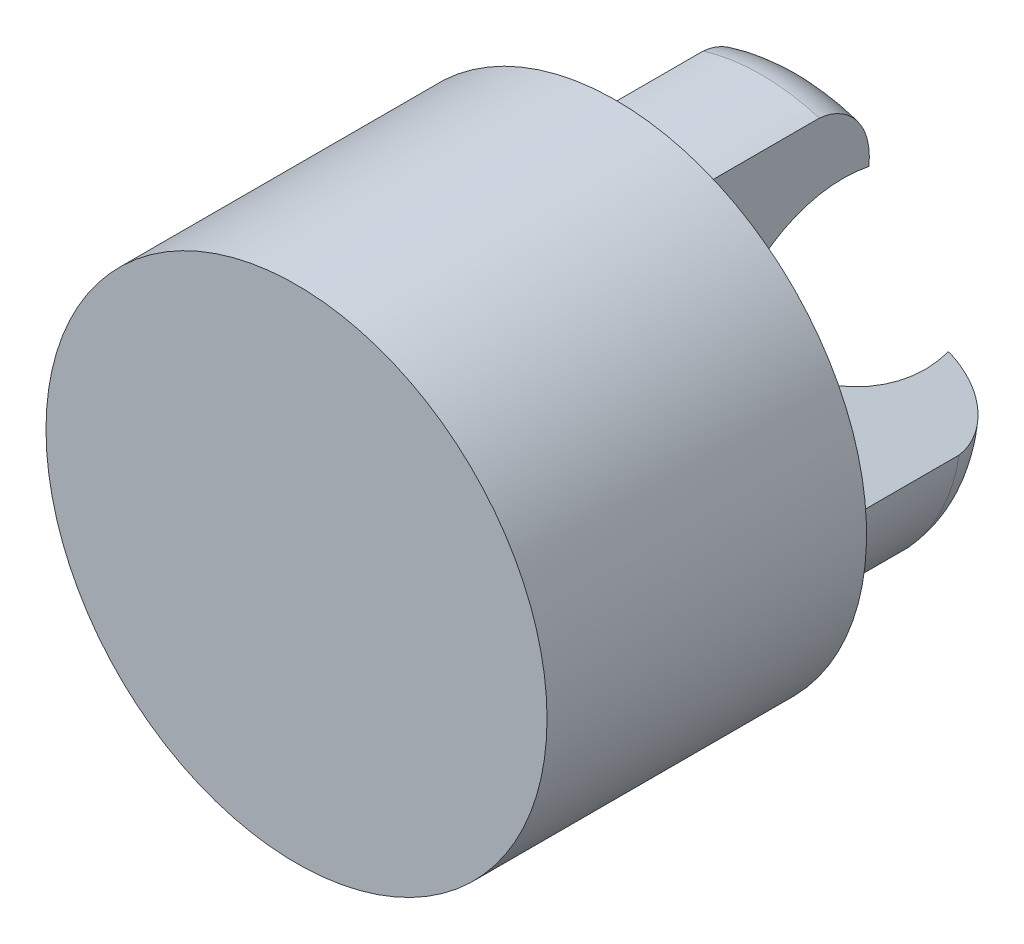
ISO-10303-21;
HEADER;
FILE_DESCRIPTION(('STEP AP214'),'2;1');
FILE_NAME('part.step','',(''),(''),'','','');
FILE_SCHEMA(('AUTOMOTIVE_DESIGN { 1 0 10303 214 1 1 1 1 }'));
ENDSEC;
DATA;
#1=APPLICATION_CONTEXT('core data for automotive mechanical design processes');
#2=APPLICATION_PROTOCOL_DEFINITION('international standard','automotive_design',2000,#1);
#3=PRODUCT_CONTEXT('',#1,'mechanical');
#4=PRODUCT('Part','Part','',(#3));
#5=PRODUCT_RELATED_PRODUCT_CATEGORY('part','',(#4));
#6=PRODUCT_DEFINITION_FORMATION('','',#4);
#7=PRODUCT_DEFINITION_CONTEXT('part definition',#1,'design');
#8=PRODUCT_DEFINITION('design','',#6,#7);
#9=PRODUCT_DEFINITION_SHAPE('','',#8);
#10=(LENGTH_UNIT() NAMED_UNIT(*) SI_UNIT(.MILLI.,.METRE.));
#11=(NAMED_UNIT(*) PLANE_ANGLE_UNIT() SI_UNIT($,.RADIAN.));
#12=(NAMED_UNIT(*) SI_UNIT($,.STERADIAN.) SOLID_ANGLE_UNIT());
#13=UNCERTAINTY_MEASURE_WITH_UNIT(LENGTH_MEASURE(1.E-05),#10,'distance_accuracy_value','');
#14=(GEOMETRIC_REPRESENTATION_CONTEXT(3) GLOBAL_UNCERTAINTY_ASSIGNED_CONTEXT((#13)) GLOBAL_UNIT_ASSIGNED_CONTEXT((#10,
#11,#12)) REPRESENTATION_CONTEXT('',''));
#15=CARTESIAN_POINT('',(0.,0.,0.));
#16=DIRECTION('',(0.,0.,1.));
#17=DIRECTION('',(1.,0.,0.));
#18=AXIS2_PLACEMENT_3D('',#15,#16,#17);
#19=CARTESIAN_POINT('',(18.3,9.34665715643834,0.));
#20=DIRECTION('',(0.,0.,1.));
#21=DIRECTION('',(1.,0.,0.));
#22=AXIS2_PLACEMENT_3D('',#19,#20,#21);
#23=PLANE('',#22);
#24=DIRECTION('',(0.866025403784441,-0.499999999999996,0.));
#25=VECTOR('',#24,1.);
#26=CARTESIAN_POINT('',(2.,1.73410161513776,0.));
#27=LINE('',#26,#25);
#28=CARTESIAN_POINT('',(2.,1.73410161513776,0.));
#29=VERTEX_POINT('',#28);
#30=CARTESIAN_POINT('',(6.81198256243961,-1.04409781262251,0.));
#31=VERTEX_POINT('',#30);
#32=EDGE_CURVE('E182',#29,#31,#27,.T.);
#33=ORIENTED_EDGE('',*,*,#32,.F.);
#34=DIRECTION('',(0.,-1.,0.));
#35=VECTOR('',#34,1.);
#36=CARTESIAN_POINT('',(2.,19.3263173688128,0.));
#37=LINE('',#36,#35);
#38=CARTESIAN_POINT('',(2.,6.59494099088873,0.));
#39=VERTEX_POINT('',#38);
#40=EDGE_CURVE('E151',#39,#29,#37,.T.);
#41=ORIENTED_EDGE('',*,*,#40,.F.);
#42=CARTESIAN_POINT('',(0.,0.,0.));
#43=DIRECTION('',(0.,0.,1.));
#44=DIRECTION('',(1.,0.,0.));
#45=AXIS2_PLACEMENT_3D('',#42,#43,#44);
#46=CIRCLE('',#45,6.89153442081692);
#47=CARTESIAN_POINT('',(-2.,6.59494099088873,0.));
#48=VERTEX_POINT('',#47);
#49=EDGE_CURVE('E158',#39,#48,#46,.T.);
#50=ORIENTED_EDGE('',*,*,#49,.T.);
#51=DIRECTION('',(0.,1.,0.));
#52=VECTOR('',#51,1.);
#53=CARTESIAN_POINT('',(-2.,19.3263173688128,0.));
#54=LINE('',#53,#52);
#55=CARTESIAN_POINT('',(-2.,1.73410161513775,0.));
#56=VERTEX_POINT('',#55);
#57=EDGE_CURVE('E271',#56,#48,#54,.T.);
#58=ORIENTED_EDGE('',*,*,#57,.F.);
#59=DIRECTION('',(0.866025403784441,0.499999999999995,0.));
#60=VECTOR('',#59,1.);
#61=CARTESIAN_POINT('',(-2.,1.73410161513775,0.));
#62=LINE('',#61,#60);
#63=CARTESIAN_POINT('',(-6.81198256243961,-1.0440978126225,0.));
#64=VERTEX_POINT('',#63);
#65=EDGE_CURVE('E278',#64,#56,#62,.T.);
#66=ORIENTED_EDGE('',*,*,#65,.F.);
#67=CARTESIAN_POINT('',(-5.07638618081831,-4.66085292800591,0.));
#68=VERTEX_POINT('',#67);
#69=EDGE_CURVE('E130',#64,#68,#46,.T.);
#70=ORIENTED_EDGE('',*,*,#69,.T.);
#71=DIRECTION('',(-0.866025403784441,-0.499999999999995,0.));
#72=VECTOR('',#71,1.);
#73=CARTESIAN_POINT('',(0.,-1.73,0.));
#74=LINE('',#73,#72);
#75=CARTESIAN_POINT('',(0.,-1.73,0.));
#76=VERTEX_POINT('',#75);
#77=EDGE_CURVE('E125',#76,#68,#74,.T.);
#78=ORIENTED_EDGE('',*,*,#77,.F.);
#79=DIRECTION('',(-0.866025403784441,0.499999999999996,0.));
#80=VECTOR('',#79,1.);
#81=CARTESIAN_POINT('',(-0.749111974273535,-1.29750000000001,0.));
#82=LINE('',#81,#80);
#83=CARTESIAN_POINT('',(5.07638618081831,-4.66085292800591,0.));
#84=VERTEX_POINT('',#83);
#85=EDGE_CURVE('E11',#84,#76,#82,.T.);
#86=ORIENTED_EDGE('',*,*,#85,.F.);
#87=EDGE_CURVE('E154',#84,#31,#46,.T.);
#88=ORIENTED_EDGE('',*,*,#87,.T.);
#89=EDGE_LOOP('',(#33,#41,#50,#58,#66,#70,#78,#86,#88));
#90=FACE_BOUND('',#89,.T.);
#91=CARTESIAN_POINT('',(0.,0.,0.));
#92=DIRECTION('',(0.,0.,-1.));
#93=DIRECTION('',(-1.,0.,0.));
#94=AXIS2_PLACEMENT_3D('',#91,#92,#93);
#95=CIRCLE('',#94,8.625);
#96=CARTESIAN_POINT('',(-8.625,0.,0.));
#97=VERTEX_POINT('',#96);
#98=EDGE_CURVE('E134',#97,#97,#95,.T.);
#99=ORIENTED_EDGE('',*,*,#98,.T.);
#100=EDGE_LOOP('',(#99));
#101=FACE_BOUND('',#100,.T.);
#102=ADVANCED_FACE('F34',(#90,#101),#23,.F.);
#103=CARTESIAN_POINT('',(0.,0.,-4.82084215098187));
#104=DIRECTION('',(0.,0.,1.));
#105=DIRECTION('',(1.,0.,0.));
#106=AXIS2_PLACEMENT_3D('',#103,#104,#105);
#107=TOROIDAL_SURFACE('',#106,5.,1.9);
#108=CARTESIAN_POINT('',(-5.07640297856512,-4.66086262618956,-4.9998));
#109=CARTESIAN_POINT('',(-5.07200709962977,-4.6583246643029,-5.05216996781322));
#110=CARTESIAN_POINT('',(-5.06568283371944,-4.65467334767715,-5.10429822705954));
#111=CARTESIAN_POINT('',(-5.04923229746504,-4.64517562614236,-5.20774325054465));
#112=CARTESIAN_POINT('',(-5.03910640937487,-4.63932944192771,-5.25906009583084));
#113=CARTESIAN_POINT('',(-5.0031606670284,-4.61857615790776,-5.41108831311908));
#114=CARTESIAN_POINT('',(-4.97175238019148,-4.60044257504768,-5.51011648743511));
#115=CARTESIAN_POINT('',(-4.89502264517052,-4.55614264187848,-5.70065974165119));
#116=CARTESIAN_POINT('',(-4.84969821042528,-4.52997456727745,-5.79217320346123));
#117=CARTESIAN_POINT('',(-4.74652187644407,-4.47040568307939,-5.96524209523091));
#118=CARTESIAN_POINT('',(-4.68867027460166,-4.43700504518263,-6.04679776151564));
#119=CARTESIAN_POINT('',(-4.56148445498952,-4.36357427799246,-6.19864064888333));
#120=CARTESIAN_POINT('',(-4.49203351288589,-4.32347675787345,-6.26879734540966));
#121=CARTESIAN_POINT('',(-4.34412909354509,-4.23808410155271,-6.39505781947714));
#122=CARTESIAN_POINT('',(-4.26567367003562,-4.19278784167013,-6.45115855052141));
#123=CARTESIAN_POINT('',(-4.09985754674565,-4.09705385825269,-6.5493044048502));
#124=CARTESIAN_POINT('',(-4.01231910157031,-4.04651351336627,-6.59094880890211));
#125=CARTESIAN_POINT('',(-3.83257017301974,-3.94273542108105,-6.65731974821868));
#126=CARTESIAN_POINT('',(-3.74035920477146,-3.88949739374067,-6.68204452383682));
#127=CARTESIAN_POINT('',(-3.55038672462432,-3.7798167311891,-6.71484749553911));
#128=CARTESIAN_POINT('',(-3.45254448726781,-3.7233274891132,-6.72230156778718));
#129=CARTESIAN_POINT('',(-3.25710211699191,-3.61048878402336,-6.71890951211631));
#130=CARTESIAN_POINT('',(-3.15950203764875,-3.55413935194165,-6.70805964317628));
#131=CARTESIAN_POINT('',(-2.96318334370289,-3.44079470114506,-6.66785278506185));
#132=CARTESIAN_POINT('',(-2.8645752976373,-3.38386331920483,-6.63777511701229));
#133=CARTESIAN_POINT('',(-2.67290709139947,-3.27320362873832,-6.55947161082214));
#134=CARTESIAN_POINT('',(-2.5798482893061,-3.21947610429925,-6.5112413511017));
#135=CARTESIAN_POINT('',(-2.39927715127796,-3.11522330915083,-6.39631677227074));
#136=CARTESIAN_POINT('',(-2.31199264931436,-3.06482957844606,-6.32914389532173));
#137=CARTESIAN_POINT('',(-2.14857426170204,-2.97047992836756,-6.17852056935425));
#138=CARTESIAN_POINT('',(-2.07244518414259,-2.92652678494545,-6.09506313746693));
#139=CARTESIAN_POINT('',(-1.93547524976702,-2.84744715646283,-5.91541866540975));
#140=CARTESIAN_POINT('',(-1.87438609416552,-2.81217731603174,-5.81948501600364));
#141=CARTESIAN_POINT('',(-1.76883710104971,-2.75123857644363,-5.61624338678896));
#142=CARTESIAN_POINT('',(-1.72433589802869,-2.72554579490019,-5.5089645687758));
#143=CARTESIAN_POINT('',(-1.66949102978566,-2.6938810954564,-5.33354400205386));
#144=CARTESIAN_POINT('',(-1.65266105610321,-2.68416430562039,-5.26803922406976));
#145=CARTESIAN_POINT('',(-1.62585764894205,-2.66868935128069,-5.13513247408863));
#146=CARTESIAN_POINT('',(-1.61588998461498,-2.66293451759827,-5.0677289552444));
#147=CARTESIAN_POINT('',(-1.60955802525281,-2.65927875915602,-4.9998));
#148=B_SPLINE_CURVE_WITH_KNOTS('',3,(#108,#109,#110,#111,#112,#113,#114,#115,#116,#117,#118,
#119,#120,#121,#122,#123,#124,#125,#126,#127,#128,#129,#130,#131,#132,#133,#134,#135,#136,#137,
#138,#139,#140,#141,#142,#143,#144,#145,#146,#147),.UNSPECIFIED.,.F.,.F.,(4,2,2,2,2,2,2,2,2,2,2,
2,2,2,2,2,2,2,2,4),(0.,0.157747659163912,0.315479461014416,0.630231526787687,0.945051189150926,
1.25986337854913,1.57805892850191,1.8963233847707,2.22281298759638,2.54933654028231,
2.88748735438249,3.22570728925726,3.57741295641436,3.92920434698736,4.29083198778353,
4.65261503779266,5.00795003026309,5.36239289709453,5.56692937174876,5.77163759116744),.UNSPECIFIED.);
#149=CARTESIAN_POINT('',(-5.07638618081831,-4.66085292800591,-5.));
#150=VERTEX_POINT('',#149);
#151=CARTESIAN_POINT('',(-3.14866958726526,-3.54788523379676,-6.7034605271999));
#152=VERTEX_POINT('',#151);
#153=EDGE_CURVE('E239',#150,#152,#148,.T.);
#154=ORIENTED_EDGE('',*,*,#153,.F.);
#155=CARTESIAN_POINT('',(0.,0.,-5.));
#156=DIRECTION('',(0.,0.,1.));
#157=DIRECTION('',(1.,0.,0.));
#158=AXIS2_PLACEMENT_3D('',#155,#156,#157);
#159=CIRCLE('',#158,6.89153442081692);
#160=CARTESIAN_POINT('',(-6.81198256243961,-1.0440978126225,-5.));
#161=VERTEX_POINT('',#160);
#162=EDGE_CURVE('E161',#161,#150,#159,.T.);
#163=ORIENTED_EDGE('',*,*,#162,.F.);
#164=CARTESIAN_POINT('',(-2.84859508834715,1.24416501244754,-4.9998));
#165=CARTESIAN_POINT('',(-2.86135190893569,1.23679985864674,-5.09262295553614));
#166=CARTESIAN_POINT('',(-2.88382264135584,1.22382637523508,-5.18272625449947));
#167=CARTESIAN_POINT('',(-2.94332907105834,1.18947032202783,-5.35483870163046));
#168=CARTESIAN_POINT('',(-2.98013817940342,1.16821857341617,-5.43695006687738));
#169=CARTESIAN_POINT('',(-3.04964794893935,1.12808708926329,-5.56638565535944));
#170=CARTESIAN_POINT('',(-3.07939453799646,1.1109128880637,-5.61594811049216));
#171=CARTESIAN_POINT('',(-3.14254615635379,1.07445228420533,-5.71187185044033));
#172=CARTESIAN_POINT('',(-3.1759516209415,1.05516563023321,-5.75823275330287));
#173=CARTESIAN_POINT('',(-3.2811957446776,0.994402907063549,-5.89326318566877));
#174=CARTESIAN_POINT('',(-3.35766143305319,0.950255421296136,-5.97717109832818));
#175=CARTESIAN_POINT('',(-3.49301009404501,0.872111835438053,-6.10716075085899));
#176=CARTESIAN_POINT('',(-3.54950750901756,0.839493037695134,-6.15666110118447));
#177=CARTESIAN_POINT('',(-3.66594101318419,0.772270122721838,-6.24997737798967));
#178=CARTESIAN_POINT('',(-3.72587805615973,0.737665454825478,-6.29379171669191));
#179=CARTESIAN_POINT('',(-3.90981208665685,0.631471092804836,-6.41627659272954));
#180=CARTESIAN_POINT('',(-4.03824507076162,0.557320274859122,-6.48628543200528));
#181=CARTESIAN_POINT('',(-4.30414198817819,0.403804618011974,-6.60100747449663));
#182=CARTESIAN_POINT('',(-4.44165313097461,0.324412522701887,-6.64557454255056));
#183=CARTESIAN_POINT('',(-4.72149307050129,0.162846858286153,-6.70571568427749));
#184=CARTESIAN_POINT('',(-4.86382147343416,0.0806735165395325,-6.72129212205198));
#185=CARTESIAN_POINT('',(-5.14040064855558,-0.0790095446690602,-6.72039837487768));
#186=CARTESIAN_POINT('',(-5.27465086332945,-0.156518942307519,-6.70569886277581));
#187=CARTESIAN_POINT('',(-5.53802014277258,-0.308575266690288,-6.64586625033923));
#188=CARTESIAN_POINT('',(-5.66714444403215,-0.383125216781423,-6.60076510196304));
#189=CARTESIAN_POINT('',(-5.89596504017929,-0.515234849563101,-6.48866896925835));
#190=CARTESIAN_POINT('',(-5.99719929080414,-0.573682471412567,-6.4258575190582));
#191=CARTESIAN_POINT('',(-6.18721161359626,-0.683386137125941,-6.27876906585018));
#192=CARTESIAN_POINT('',(-6.27600293825979,-0.734649832322136,-6.19451517399905));
#193=CARTESIAN_POINT('',(-6.42654820937235,-0.821567185124197,-6.01896292465992));
#194=CARTESIAN_POINT('',(-6.49030917393048,-0.85837959517562,-5.9299532929635));
#195=CARTESIAN_POINT('',(-6.60251796265245,-0.923163369549691,-5.73992110941344));
#196=CARTESIAN_POINT('',(-6.65098092964296,-0.951143476587392,-5.63891057395648));
#197=CARTESIAN_POINT('',(-6.72265668031462,-0.992525490532038,-5.44890850906721));
#198=CARTESIAN_POINT('',(-6.74896180880948,-1.00771276354961,-5.36146421073453));
#199=CARTESIAN_POINT('',(-6.77943246855901,-1.02530500715839,-5.22757861378473));
#200=CARTESIAN_POINT('',(-6.78809518932222,-1.03030643132295,-5.18245577782329));
#201=CARTESIAN_POINT('',(-6.80235887847081,-1.03854157609252,-5.09155521263653));
#202=CARTESIAN_POINT('',(-6.8079588993443,-1.0417747496513,-5.04577728523423));
#203=CARTESIAN_POINT('',(-6.812000158837,-1.04410797190727,-4.99979999999982));
#204=B_SPLINE_CURVE_WITH_KNOTS('',3,(#164,#165,#166,#167,#168,#169,#170,#171,#172,#173,#174,
#175,#176,#177,#178,#179,#180,#181,#182,#183,#184,#185,#186,#187,#188,#189,#190,#191,#192,#193,
#194,#195,#196,#197,#198,#199,#200,#201,#202,#203),.UNSPECIFIED.,.F.,.F.,(4,2,2,2,2,2,2,2,2,2,2,
2,2,2,2,2,2,2,2,4),(0.,0.279957346464033,0.555659160720078,0.736369792264264,0.917101945910295,
1.28107717184619,1.52649741707839,1.77198604734205,2.26157781778075,2.75395417161858,
3.24629037183876,3.71065085076333,4.17452404865145,4.57033263432723,4.9657164019131,
5.31039965535916,5.65474064401568,5.93131024662711,6.06984029009961,6.2084131666036),.UNSPECIFIED.);
#205=CARTESIAN_POINT('',(-4.74116663820916,0.151488318674096,-6.7034605271999));
#206=VERTEX_POINT('',#205);
#207=EDGE_CURVE('E58',#206,#161,#204,.T.);
#208=ORIENTED_EDGE('',*,*,#207,.F.);
#209=CARTESIAN_POINT('',(0.,0.,-6.7034605271999));
#210=DIRECTION('',(0.,0.,1.));
#211=DIRECTION('',(1.,0.,0.));
#212=AXIS2_PLACEMENT_3D('',#209,#210,#211);
#213=CIRCLE('',#212,4.7435861752436);
#214=EDGE_CURVE('E165',#206,#152,#213,.T.);
#215=ORIENTED_EDGE('',*,*,#214,.T.);
#216=EDGE_LOOP('',(#154,#163,#208,#215));
#217=FACE_BOUND('',#216,.T.);
#218=ADVANCED_FACE('F237',(#217),#107,.T.);
#219=CARTESIAN_POINT('',(0.,0.,0.));
#220=DIRECTION('',(0.,0.,1.));
#221=DIRECTION('',(1.,0.,0.));
#222=AXIS2_PLACEMENT_3D('',#219,#220,#221);
#223=CYLINDRICAL_SURFACE('',#222,6.89153442081692);
#224=DIRECTION('',(0.,0.,1.));
#225=VECTOR('',#224,1.);
#226=CARTESIAN_POINT('',(5.07638618081831,-4.66085292800591,0.));
#227=LINE('',#226,#225);
#228=CARTESIAN_POINT('',(5.07638618081831,-4.66085292800591,-5.));
#229=VERTEX_POINT('',#228);
#230=EDGE_CURVE('E146',#229,#84,#227,.T.);
#231=ORIENTED_EDGE('',*,*,#230,.F.);
#232=CARTESIAN_POINT('',(6.81198256243961,-1.04409781262251,-5.));
#233=VERTEX_POINT('',#232);
#234=EDGE_CURVE('E225',#229,#233,#159,.T.);
#235=ORIENTED_EDGE('',*,*,#234,.T.);
#236=DIRECTION('',(0.,0.,1.));
#237=VECTOR('',#236,1.);
#238=CARTESIAN_POINT('',(6.81198256243961,-1.04409781262251,0.));
#239=LINE('',#238,#237);
#240=EDGE_CURVE('E43',#31,#233,#239,.F.);
#241=ORIENTED_EDGE('',*,*,#240,.F.);
#242=ORIENTED_EDGE('',*,*,#87,.F.);
#243=EDGE_LOOP('',(#231,#235,#241,#242));
#244=FACE_BOUND('',#243,.T.);
#245=ADVANCED_FACE('F155',(#244),#223,.T.);
#246=CARTESIAN_POINT('',(1.60955802525281,-2.65927875915602,-4.9998));
#247=CARTESIAN_POINT('',(1.61427793761376,-2.66200380182817,-5.05037957089082));
#248=CARTESIAN_POINT('',(1.62101264854154,-2.66589208899524,-5.10069674536308));
#249=CARTESIAN_POINT('',(1.63834993390222,-2.67590177536524,-5.20040397364947));
#250=CARTESIAN_POINT('',(1.64895012368799,-2.68202179779152,-5.24979457936243));
#251=CARTESIAN_POINT('',(1.67380213466026,-2.69637011301626,-5.34707196671413));
#252=CARTESIAN_POINT('',(1.68803591006372,-2.70458798707703,-5.39496490356196));
#253=CARTESIAN_POINT('',(1.71996793518144,-2.72302395037452,-5.48917644881615));
#254=CARTESIAN_POINT('',(1.7376666333804,-2.733242298544,-5.53549485250987));
#255=CARTESIAN_POINT('',(1.79554429536248,-2.76665798226941,-5.6714519229526));
#256=CARTESIAN_POINT('',(1.84058438595659,-2.79266189069825,-5.75839702060064));
#257=CARTESIAN_POINT('',(1.94176794546688,-2.85108024601908,-5.92322971881994));
#258=CARTESIAN_POINT('',(1.99792582353554,-2.88350301203914,-6.00110535471213));
#259=CARTESIAN_POINT('',(2.12437604317327,-2.95650908038606,-6.15219780857457));
#260=CARTESIAN_POINT('',(2.19543445361044,-2.99753467278016,-6.22456079155557));
#261=CARTESIAN_POINT('',(2.34632209448295,-3.08464969285528,-6.35580391204771));
#262=CARTESIAN_POINT('',(2.42615282448995,-3.13073998631443,-6.41468173903584));
#263=CARTESIAN_POINT('',(2.59983828187701,-3.23101733189117,-6.52226429371619));
#264=CARTESIAN_POINT('',(2.69430876437468,-3.28555989039167,-6.5696491861705));
#265=CARTESIAN_POINT('',(2.88872967696122,-3.39780885660961,-6.64582760011198));
#266=CARTESIAN_POINT('',(2.98868117207466,-3.45551587921926,-6.6746174943876));
#267=CARTESIAN_POINT('',(3.19322307359372,-3.57360820112184,-6.71292103332744));
#268=CARTESIAN_POINT('',(3.2978649269162,-3.63402320330607,-6.72207170741991));
#269=CARTESIAN_POINT('',(3.50695305017824,-3.75474028755577,-6.71934769868069));
#270=CARTESIAN_POINT('',(3.61139934380499,-3.81504238329703,-6.70747575271118));
#271=CARTESIAN_POINT('',(3.8139942378013,-3.93201059988224,-6.66324618165456));
#272=CARTESIAN_POINT('',(3.91223717382402,-3.98873118544094,-6.63146638098841));
#273=CARTESIAN_POINT('',(4.10238147753444,-4.09851105037302,-6.54849680797611));
#274=CARTESIAN_POINT('',(4.19428412501793,-4.15157106863685,-6.49731096639458));
#275=CARTESIAN_POINT('',(4.36510079773476,-4.25019212061199,-6.37926766890195));
#276=CARTESIAN_POINT('',(4.44439324815815,-4.29597163820864,-6.31314017925));
#277=CARTESIAN_POINT('',(4.59177849485847,-4.38106455006564,-6.16592225344517));
#278=CARTESIAN_POINT('',(4.65987346104358,-4.42037919712308,-6.08483472280678));
#279=CARTESIAN_POINT('',(4.78039056606831,-4.48995978015106,-5.91315865899096));
#280=CARTESIAN_POINT('',(4.83328389608377,-4.52049775847382,-5.82301047890518));
#281=CARTESIAN_POINT('',(4.92480622987538,-4.57333820252527,-5.63354812444803));
#282=CARTESIAN_POINT('',(4.96344449943115,-4.59564601785431,-5.53423995672993));
#283=CARTESIAN_POINT('',(5.01537958697583,-4.62563075462862,-5.36203336219247));
#284=CARTESIAN_POINT('',(5.03282742875265,-4.63570427077524,-5.29076493265018));
#285=CARTESIAN_POINT('',(5.06025502803456,-4.65153960260388,-5.14641846074624));
#286=CARTESIAN_POINT('',(5.07024280598506,-4.65730604889221,-5.07334244935844));
#287=CARTESIAN_POINT('',(5.07640297856512,-4.66086262618956,-4.99979999999999));
#288=B_SPLINE_CURVE_WITH_KNOTS('',3,(#246,#247,#248,#249,#250,#251,#252,#253,#254,#255,#256,
#257,#258,#259,#260,#261,#262,#263,#264,#265,#266,#267,#268,#269,#270,#271,#272,#273,#274,#275,
#276,#277,#278,#279,#280,#281,#282,#283,#284,#285,#286,#287),.UNSPECIFIED.,.F.,.F.,(4,2,2,2,2,2,
2,2,2,2,2,2,2,2,2,2,2,2,2,2,4),(0.,0.152546295110461,0.30499864186575,0.456708101743875,
0.608437211240958,0.910952874866734,1.21386320985917,1.5406992919887,1.86759133181749,
2.22274867032697,2.57797526628083,2.93971253381584,3.30140271148989,3.65305248549593,
4.00463106957448,4.34177039901022,4.67884431860055,5.00393274718812,5.32880949467051,
5.55050060384223,5.7719530245804),.UNSPECIFIED.);
#289=CARTESIAN_POINT('',(3.14866958726525,-3.54788523379676,-6.70346052719989));
#290=VERTEX_POINT('',#289);
#291=EDGE_CURVE('E148',#290,#229,#288,.T.);
#292=ORIENTED_EDGE('',*,*,#291,.F.);
#293=CARTESIAN_POINT('',(4.74116663820915,0.151488318674097,-6.7034605271999));
#294=VERTEX_POINT('',#293);
#295=EDGE_CURVE('E169',#290,#294,#213,.T.);
#296=ORIENTED_EDGE('',*,*,#295,.T.);
#297=CARTESIAN_POINT('',(6.812000158837,-1.04410797190728,-4.99979999999982));
#298=CARTESIAN_POINT('',(6.80753262569968,-1.04152864044784,-5.05061703250833));
#299=CARTESIAN_POINT('',(6.80116283666685,-1.03785104103505,-5.10118477011139));
#300=CARTESIAN_POINT('',(6.78468820318511,-1.02833940695957,-5.20149207763005));
#301=CARTESIAN_POINT('',(6.77458411252333,-1.02250580749607,-5.25123181256598));
#302=CARTESIAN_POINT('',(6.73885228623975,-1.00187602797261,-5.39840931034436));
#303=CARTESIAN_POINT('',(6.70777343604639,-0.983932645447372,-5.49415712037708));
#304=CARTESIAN_POINT('',(6.63223027423131,-0.940317780637996,-5.67821708469197));
#305=CARTESIAN_POINT('',(6.58776940073762,-0.914648283358013,-5.7665311414154));
#306=CARTESIAN_POINT('',(6.48697970497507,-0.856457325377963,-5.93363240109218));
#307=CARTESIAN_POINT('',(6.43064738803605,-0.823933847029149,-6.0124167879649));
#308=CARTESIAN_POINT('',(6.30612613549051,-0.75204146835215,-6.16086687700164));
#309=CARTESIAN_POINT('',(6.23763699430769,-0.71249924425368,-6.23019588877556));
#310=CARTESIAN_POINT('',(6.09213516922065,-0.628493726372096,-6.35564930297704));
#311=CARTESIAN_POINT('',(6.01511995745777,-0.584028973129104,-6.41176977376041));
#312=CARTESIAN_POINT('',(5.84887586125537,-0.488047899435462,-6.51366580421547));
#313=CARTESIAN_POINT('',(5.75916611596246,-0.436253953841669,-6.55839313814484));
#314=CARTESIAN_POINT('',(5.57493162080166,-0.329886118466567,-6.63160100241674));
#315=CARTESIAN_POINT('',(5.48040533445651,-0.275311341599701,-6.66007631256882));
#316=CARTESIAN_POINT('',(5.27903288772737,-0.159048905273259,-6.70316283026905));
#317=CARTESIAN_POINT('',(5.17191343155449,-0.0972034584164024,-6.71606398165583));
#318=CARTESIAN_POINT('',(4.95722897751041,0.0267446689167759,-6.723416904849));
#319=CARTESIAN_POINT('',(4.84966381201357,0.0888474461718022,-6.71786095708703));
#320=CARTESIAN_POINT('',(4.62261246211759,0.219935604154113,-6.68772693320269));
#321=CARTESIAN_POINT('',(4.50335936749593,0.288786410435624,-6.66080885456134));
#322=CARTESIAN_POINT('',(4.26957694200659,0.423760756723696,-6.58703383086597));
#323=CARTESIAN_POINT('',(4.15505119069666,0.489882230071626,-6.54016206998491));
#324=CARTESIAN_POINT('',(3.91798836904509,0.62675051396701,-6.42075988412925));
#325=CARTESIAN_POINT('',(3.79641321157704,0.696941963857961,-6.34564504825355));
#326=CARTESIAN_POINT('',(3.62309452285731,0.79700755544589,-6.21684423272776));
#327=CARTESIAN_POINT('',(3.56677539530305,0.829523418899864,-6.17116689529939));
#328=CARTESIAN_POINT('',(3.45768317634781,0.892507840880164,-6.07449444514314));
#329=CARTESIAN_POINT('',(3.40490865459825,0.922977225218631,-6.02350149887154));
#330=CARTESIAN_POINT('',(3.28770130468604,0.990646920241443,-5.89935518452489));
#331=CARTESIAN_POINT('',(3.22478719409996,1.02697039892414,-5.82426019144493));
#332=CARTESIAN_POINT('',(3.10899079168859,1.09382548302754,-5.66503946071033));
#333=CARTESIAN_POINT('',(3.05604694427236,1.12439262758523,-5.58097451873575));
#334=CARTESIAN_POINT('',(2.97094344153819,1.17352715779779,-5.41685019812485));
#335=CARTESIAN_POINT('',(2.93683480185398,1.19321979010116,-5.3381866498862));
#336=CARTESIAN_POINT('',(2.88162326053107,1.22509618834631,-5.17382144543734));
#337=CARTESIAN_POINT('',(2.86071205829266,1.23716927658774,-5.08803566160503));
#338=CARTESIAN_POINT('',(2.84859508834716,1.24416501244753,-4.9998));
#339=B_SPLINE_CURVE_WITH_KNOTS('',3,(#297,#298,#299,#300,#301,#302,#303,#304,#305,#306,#307,
#308,#309,#310,#311,#312,#313,#314,#315,#316,#317,#318,#319,#320,#321,#322,#323,#324,#325,#326,
#327,#328,#329,#330,#331,#332,#333,#334,#335,#336,#337,#338),.UNSPECIFIED.,.F.,.F.,(4,2,2,2,2,2,
2,2,2,2,2,2,2,2,2,2,2,2,2,2,4),(0.,0.15313586166468,0.306240828970786,0.611403836423971,
0.91648850780076,1.22166311460406,1.53582101508323,1.85007230963171,2.18716182256708,
2.52435954864538,2.89594562476599,3.26768713404361,3.68693127204771,4.10648724785133,
4.58187353831773,4.82006007696931,5.05814991587884,5.37073402821694,5.68132001046306,
5.94380697729675,6.21002389343853),.UNSPECIFIED.);
#340=EDGE_CURVE('E179',#233,#294,#339,.T.);
#341=ORIENTED_EDGE('',*,*,#340,.F.);
#342=ORIENTED_EDGE('',*,*,#234,.F.);
#343=EDGE_LOOP('',(#292,#296,#341,#342));
#344=FACE_BOUND('',#343,.T.);
#345=ADVANCED_FACE('F290',(#344),#107,.T.);
#346=DIRECTION('',(0.,0.,1.));
#347=VECTOR('',#346,1.);
#348=CARTESIAN_POINT('',(-5.07638618081831,-4.66085292800591,0.));
#349=LINE('',#348,#347);
#350=EDGE_CURVE('E234',#68,#150,#349,.F.);
#351=ORIENTED_EDGE('',*,*,#350,.F.);
#352=ORIENTED_EDGE('',*,*,#69,.F.);
#353=DIRECTION('',(0.,0.,1.));
#354=VECTOR('',#353,1.);
#355=CARTESIAN_POINT('',(-6.81198256243961,-1.0440978126225,0.));
#356=LINE('',#355,#354);
#357=EDGE_CURVE('E168',#161,#64,#356,.T.);
#358=ORIENTED_EDGE('',*,*,#357,.F.);
#359=ORIENTED_EDGE('',*,*,#162,.T.);
#360=EDGE_LOOP('',(#351,#352,#358,#359));
#361=FACE_BOUND('',#360,.T.);
#362=ADVANCED_FACE('F233',(#361),#223,.T.);
#363=CARTESIAN_POINT('',(2.,6.59494099088873,-5.));
#364=VERTEX_POINT('',#363);
#365=CARTESIAN_POINT('',(-2.,6.59494099088873,-5.));
#366=VERTEX_POINT('',#365);
#367=EDGE_CURVE('E221',#364,#366,#159,.T.);
#368=ORIENTED_EDGE('',*,*,#367,.F.);
#369=CARTESIAN_POINT('',(2.,2.63163378072716,-5.68005239672743));
#370=CARTESIAN_POINT('',(2.,2.69778167080901,-5.78392402861076));
#371=CARTESIAN_POINT('',(2.,2.77406692534792,-5.88147525445569));
#372=CARTESIAN_POINT('',(2.,2.9421505134228,-6.06238272151812));
#373=CARTESIAN_POINT('',(2.,3.03399892010819,-6.14569134286297));
#374=CARTESIAN_POINT('',(2.,3.22900748283565,-6.29637451421132));
#375=CARTESIAN_POINT('',(2.,3.33209374124993,-6.36384493321258));
#376=CARTESIAN_POINT('',(2.,3.54718099223418,-6.48234632401338));
#377=CARTESIAN_POINT('',(2.,3.65917503705745,-6.53338995429734));
#378=CARTESIAN_POINT('',(2.,3.90138893806603,-6.62222611388858));
#379=CARTESIAN_POINT('',(2.,4.03230381059978,-6.65814199654062));
#380=CARTESIAN_POINT('',(2.,4.29842789896713,-6.70702594236225));
#381=CARTESIAN_POINT('',(2.,4.43363837429066,-6.71998721073172));
#382=CARTESIAN_POINT('',(2.,4.70148407623133,-6.72159834101478));
#383=CARTESIAN_POINT('',(2.,4.83411537094496,-6.71074035591015));
#384=CARTESIAN_POINT('',(2.,5.09519308646703,-6.66502492747288));
#385=CARTESIAN_POINT('',(2.,5.22364155375141,-6.63017941073043));
#386=CARTESIAN_POINT('',(2.,5.46218737069965,-6.54026293542977));
#387=CARTESIAN_POINT('',(2.,5.57293770464838,-6.48692554271083));
#388=CARTESIAN_POINT('',(2.,5.78286773026784,-6.36094557953265));
#389=CARTESIAN_POINT('',(2.,5.88205301965902,-6.28831240491169));
#390=CARTESIAN_POINT('',(2.,6.05804831403683,-6.13187172577635));
#391=CARTESIAN_POINT('',(2.,6.13598512995455,-6.04933051938348));
#392=CARTESIAN_POINT('',(2.,6.27589992701439,-5.87167415786301));
#393=CARTESIAN_POINT('',(2.,6.33788368792821,-5.77656357555929));
#394=CARTESIAN_POINT('',(2.,6.44061269507664,-5.58223379357622));
#395=CARTESIAN_POINT('',(2.,6.48234643083094,-5.48353627883128));
#396=CARTESIAN_POINT('',(2.,6.5480286150653,-5.28039198471756));
#397=CARTESIAN_POINT('',(2.,6.57198092478848,-5.1759464588259));
#398=CARTESIAN_POINT('',(2.,6.60077272952752,-4.96787722533491));
#399=CARTESIAN_POINT('',(2.,6.60620026289814,-4.86433449073288));
#400=CARTESIAN_POINT('',(2.,6.59940906243645,-4.65783460972862));
#401=CARTESIAN_POINT('',(2.,6.58719189074591,-4.55487741229705));
#402=CARTESIAN_POINT('',(2.,6.54573179457827,-4.35349042168633));
#403=CARTESIAN_POINT('',(2.,6.51665319916343,-4.25502669005409));
#404=CARTESIAN_POINT('',(2.,6.44256192424451,-4.06429871374115));
#405=CARTESIAN_POINT('',(2.,6.39754894584222,-3.97203458539163));
#406=CARTESIAN_POINT('',(2.,6.29242026241023,-3.79510377360283));
#407=CARTESIAN_POINT('',(2.,6.23213451687199,-3.71053826354475));
#408=CARTESIAN_POINT('',(2.,6.09862855973965,-3.55233907943618));
#409=CARTESIAN_POINT('',(2.,6.02540690859821,-3.47870662372974));
#410=CARTESIAN_POINT('',(2.,5.86568072821934,-3.34185437039072));
#411=CARTESIAN_POINT('',(2.,5.7788253500812,-3.2790445440067));
#412=CARTESIAN_POINT('',(2.,5.59622873647346,-3.16807643828326));
#413=CARTESIAN_POINT('',(2.,5.50048578925202,-3.11992098905962));
#414=CARTESIAN_POINT('',(2.,5.29761238277037,-3.03689377773684));
#415=CARTESIAN_POINT('',(2.,5.19014920541566,-3.00283620244885));
#416=CARTESIAN_POINT('',(2.,4.97122821679688,-2.9519803148992));
#417=CARTESIAN_POINT('',(2.,4.85976925526259,-2.93518701448474));
#418=CARTESIAN_POINT('',(2.,4.62790449515452,-2.91806825385344));
#419=CARTESIAN_POINT('',(2.,4.5074097607963,-2.91895239054746));
#420=CARTESIAN_POINT('',(2.,4.26804237955698,-2.93943555273455));
#421=CARTESIAN_POINT('',(2.,4.14917015416109,-2.95903935066389));
#422=CARTESIAN_POINT('',(2.,3.9068917106502,-3.01809382042808));
#423=CARTESIAN_POINT('',(2.,3.78382388007747,-3.05893508098827));
#424=CARTESIAN_POINT('',(2.,3.54565343429581,-3.15970224741006));
#425=CARTESIAN_POINT('',(2.,3.4305584297792,-3.21964609071659));
#426=CARTESIAN_POINT('',(2.,3.205849483237,-3.3607387666507));
#427=CARTESIAN_POINT('',(2.,3.09681391962321,-3.44281268582658));
#428=CARTESIAN_POINT('',(2.,2.89508095805337,-3.62508112012744));
#429=CARTESIAN_POINT('',(2.,2.80236288791399,-3.72525237721534));
#430=CARTESIAN_POINT('',(2.,2.66185073877218,-3.91141710876128));
#431=CARTESIAN_POINT('',(2.,2.6087634510505,-3.99343098803969));
#432=CARTESIAN_POINT('',(2.,2.5165134667757,-4.16503422576246));
#433=CARTESIAN_POINT('',(2.,2.47733427497732,-4.2546144531574));
#434=CARTESIAN_POINT('',(2.,2.43108918081748,-4.3935927537774));
#435=CARTESIAN_POINT('',(2.,2.41772418742589,-4.44095266800339));
#436=CARTESIAN_POINT('',(2.,2.39562706568851,-4.5367319356583));
#437=CARTESIAN_POINT('',(2.,2.38689241592755,-4.58515069751188));
#438=CARTESIAN_POINT('',(2.,2.37430773882799,-4.68260480624152));
#439=CARTESIAN_POINT('',(2.,2.37045591465433,-4.73163991959346));
#440=CARTESIAN_POINT('',(2.,2.36773990697371,-4.82983149495282));
#441=CARTESIAN_POINT('',(2.,2.36887499631154,-4.87898793822417));
#442=CARTESIAN_POINT('',(2.,2.37869080857532,-5.011680572133));
#443=CARTESIAN_POINT('',(2.,2.39214728951385,-5.09490285141636));
#444=CARTESIAN_POINT('',(2.,2.43247531066217,-5.25792147796785));
#445=CARTESIAN_POINT('',(2.,2.45934216823261,-5.33771901053512));
#446=CARTESIAN_POINT('',(2.,2.5114180670105,-5.46108912790605));
#447=CARTESIAN_POINT('',(2.,2.53291559535287,-5.50627775299167));
#448=CARTESIAN_POINT('',(2.,2.57959749722036,-5.59467503830991));
#449=CARTESIAN_POINT('',(2.,2.60478029692044,-5.63788453345463));
#450=CARTESIAN_POINT('',(2.,2.63163378072716,-5.68005239672743));
#451=B_SPLINE_CURVE_WITH_KNOTS('',3,(#369,#370,#371,#372,#373,#374,#375,#376,#377,#378,#379,
#380,#381,#382,#383,#384,#385,#386,#387,#388,#389,#390,#391,#392,#393,#394,#395,#396,#397,#398,
#399,#400,#401,#402,#403,#404,#405,#406,#407,#408,#409,#410,#411,#412,#413,#414,#415,#416,#417,
#418,#419,#420,#421,#422,#423,#424,#425,#426,#427,#428,#429,#430,#431,#432,#433,#434,#435,#436,
#437,#438,#439,#440,#441,#442,#443,#444,#445,#446,#447,#448,#449,#450),.UNSPECIFIED.,.T.,.F.,(4,
2,2,2,2,2,2,2,2,2,2,2,2,2,2,2,2,2,2,2,2,2,2,2,2,2,2,2,2,2,2,2,2,2,2,2,2,2,2,2,4),(0.,
0.369234435589539,0.739680229629595,1.1078222946527,1.47567998627311,1.8809654743144,
2.28637091095746,2.68347889958826,3.08038958877063,3.44721028455806,3.81385268798085,
4.15267121783556,4.49136682081699,4.8112488347026,5.13106136575791,5.44062251302101,
5.75015625553279,6.05672285165005,6.36329519866845,6.67344354235419,6.98362642206627,
7.30376316662814,7.62396169818371,7.96069180174192,8.29751963101931,8.65746953959026,
9.01751123917917,9.40481918233145,9.79249188704443,10.1999242388209,10.6068366507728,
10.8988872318332,11.1905902693435,11.3380271240331,11.4853836105215,11.6326858554169,
11.7799666224901,12.0315824169328,12.2831104134952,12.4330691621807,12.5829640556492),.UNSPECIFIED.);
#452=CARTESIAN_POINT('',(2.,4.30134976512748,-6.7034605271999));
#453=VERTEX_POINT('',#452);
#454=EDGE_CURVE('E50',#453,#364,#451,.T.);
#455=ORIENTED_EDGE('',*,*,#454,.F.);
#456=CARTESIAN_POINT('',(-2.,4.30134976512748,-6.7034605271999));
#457=VERTEX_POINT('',#456);
#458=EDGE_CURVE('E160',#453,#457,#213,.T.);
#459=ORIENTED_EDGE('',*,*,#458,.T.);
#460=CARTESIAN_POINT('',(-2.,2.63163378072715,-5.68005239672743));
#461=CARTESIAN_POINT('',(-2.,2.58353402340315,-5.6045191582907));
#462=CARTESIAN_POINT('',(-2.,2.54076118128425,-5.52560065262462));
#463=CARTESIAN_POINT('',(-2.,2.46812486845837,-5.36202513383844));
#464=CARTESIAN_POINT('',(-2.,2.4382473642254,-5.27737447550973));
#465=CARTESIAN_POINT('',(-2.,2.39345670813668,-5.10350014686241));
#466=CARTESIAN_POINT('',(-2.,2.37864871849937,-5.01424884551786));
#467=CARTESIAN_POINT('',(-2.,2.36582917953886,-4.83454654903317));
#468=CARTESIAN_POINT('',(-2.,2.36781104825518,-4.74409603789007));
#469=CARTESIAN_POINT('',(-2.,2.38750355951882,-4.57235316254649));
#470=CARTESIAN_POINT('',(-2.,2.40393809372802,-4.49090873542883));
#471=CARTESIAN_POINT('',(-2.,2.44948489823086,-4.33165807555065));
#472=CARTESIAN_POINT('',(-2.,2.47860388908509,-4.25385379566924));
#473=CARTESIAN_POINT('',(-2.,2.54979696238292,-4.09874960986121));
#474=CARTESIAN_POINT('',(-2.,2.59254629013943,-4.02176295044276));
#475=CARTESIAN_POINT('',(-2.,2.6881502892913,-3.8743857447821));
#476=CARTESIAN_POINT('',(-2.,2.74100941105523,-3.80399812387167));
#477=CARTESIAN_POINT('',(-2.,2.86725324782245,-3.65608611251204));
#478=CARTESIAN_POINT('',(-2.,2.94261082016542,-3.58024554068538));
#479=CARTESIAN_POINT('',(-2.,3.10313534144027,-3.43976853481478));
#480=CARTESIAN_POINT('',(-2.,3.18830971089514,-3.37514067013984));
#481=CARTESIAN_POINT('',(-2.,3.38368273885051,-3.24649146981705));
#482=CARTESIAN_POINT('',(-2.,3.4955433135155,-3.18497852756913));
#483=CARTESIAN_POINT('',(-2.,3.72753359758717,-3.08019110547047));
#484=CARTESIAN_POINT('',(-2.,3.8476669611274,-3.03692474612379));
#485=CARTESIAN_POINT('',(-2.,4.1016189991065,-2.96776560814204));
#486=CARTESIAN_POINT('',(-2.,4.23581447554387,-2.94323897468443));
#487=CARTESIAN_POINT('',(-2.,4.50646048879095,-2.91810952549703));
#488=CARTESIAN_POINT('',(-2.,4.64291066759766,-2.9175029475578));
#489=CARTESIAN_POINT('',(-2.,4.90798554893506,-2.94076725167639));
#490=CARTESIAN_POINT('',(-2.,5.03669862612269,-2.96361386729764));
#491=CARTESIAN_POINT('',(-2.,5.2877865270207,-3.03249044527493));
#492=CARTESIAN_POINT('',(-2.,5.41016440951103,-3.07850910229622));
#493=CARTESIAN_POINT('',(-2.,5.63462124872212,-3.1884471051776));
#494=CARTESIAN_POINT('',(-2.,5.73754056131568,-3.25065098131434));
#495=CARTESIAN_POINT('',(-2.,5.9303919036341,-3.39270606222495));
#496=CARTESIAN_POINT('',(-2.,6.02032995718263,-3.47254903793972));
#497=CARTESIAN_POINT('',(-2.,6.17788209138544,-3.64133491195348));
#498=CARTESIAN_POINT('',(-2.,6.24663306319577,-3.72921787563033));
#499=CARTESIAN_POINT('',(-2.,6.36748810748381,-3.9157713020517));
#500=CARTESIAN_POINT('',(-2.,6.41959758511698,-4.01443824815567));
#501=CARTESIAN_POINT('',(-2.,6.50310346876905,-4.21444574190088));
#502=CARTESIAN_POINT('',(-2.,6.53539734620982,-4.31541230305331));
#503=CARTESIAN_POINT('',(-2.,6.58206618941286,-4.52140284229612));
#504=CARTESIAN_POINT('',(-2.,6.59644440039938,-4.62642608200972));
#505=CARTESIAN_POINT('',(-2.,6.60664094399798,-4.83460724167908));
#506=CARTESIAN_POINT('',(-2.,6.602934394694,-4.9377422020021));
#507=CARTESIAN_POINT('',(-2.,6.57817863384789,-5.14190288653747));
#508=CARTESIAN_POINT('',(-2.,6.55713045436575,-5.24292873590343));
#509=CARTESIAN_POINT('',(-2.,6.49851909654806,-5.43961806427486));
#510=CARTESIAN_POINT('',(-2.,6.46102241845195,-5.53530140458977));
#511=CARTESIAN_POINT('',(-2.,6.37075541505122,-5.71915827534737));
#512=CARTESIAN_POINT('',(-2.,6.31798441659988,-5.80733147459278));
#513=CARTESIAN_POINT('',(-2.,6.19781430949666,-5.97534315028156));
#514=CARTESIAN_POINT('',(-2.,6.13018179200276,-6.05501447046475));
#515=CARTESIAN_POINT('',(-2.,5.98293473294063,-6.20236459131304));
#516=CARTESIAN_POINT('',(-2.,5.90331859907543,-6.2700417956801));
#517=CARTESIAN_POINT('',(-2.,5.73127361467686,-6.39426036219793));
#518=CARTESIAN_POINT('',(-2.,5.63847804540135,-6.45029320201021));
#519=CARTESIAN_POINT('',(-2.,5.44518888371241,-6.54692563615233));
#520=CARTESIAN_POINT('',(-2.,5.34469362755723,-6.58752188359236));
#521=CARTESIAN_POINT('',(-2.,5.13286107710986,-6.65464721419615));
#522=CARTESIAN_POINT('',(-2.,5.02123196208775,-6.68025381841762));
#523=CARTESIAN_POINT('',(-2.,4.7953599709582,-6.71372177206449));
#524=CARTESIAN_POINT('',(-2.,4.68111633376823,-6.72157788624087));
#525=CARTESIAN_POINT('',(-2.,4.44453668869835,-6.71994148446615));
#526=CARTESIAN_POINT('',(-2.,4.32220985042848,-6.70916006738452));
#527=CARTESIAN_POINT('',(-2.,4.08073131752316,-6.66869129941117));
#528=CARTESIAN_POINT('',(-2.,3.96158072661366,-6.6389974635446));
#529=CARTESIAN_POINT('',(-2.,3.72055915323597,-6.55902016604468));
#530=CARTESIAN_POINT('',(-2.,3.59913857133002,-6.50737650026389));
#531=CARTESIAN_POINT('',(-2.,3.36615236072483,-6.38508128058056));
#532=CARTESIAN_POINT('',(-2.,3.25459417730888,-6.31441552665179));
#533=CARTESIAN_POINT('',(-2.,3.04823416147092,-6.15809750431186));
#534=CARTESIAN_POINT('',(-2.,2.953001427269,-6.0730155526441));
#535=CARTESIAN_POINT('',(-2.,2.77883560574451,-5.88755943946185));
#536=CARTESIAN_POINT('',(-2.,2.69987378782858,-5.78721278617795));
#537=CARTESIAN_POINT('',(-2.,2.63163378072715,-5.68005239672743));
#538=B_SPLINE_CURVE_WITH_KNOTS('',3,(#460,#461,#462,#463,#464,#465,#466,#467,#468,#469,#470,
#471,#472,#473,#474,#475,#476,#477,#478,#479,#480,#481,#482,#483,#484,#485,#486,#487,#488,#489,
#490,#491,#492,#493,#494,#495,#496,#497,#498,#499,#500,#501,#502,#503,#504,#505,#506,#507,#508,
#509,#510,#511,#512,#513,#514,#515,#516,#517,#518,#519,#520,#521,#522,#523,#524,#525,#526,#527,
#528,#529,#530,#531,#532,#533,#534,#535,#536,#537),.UNSPECIFIED.,.T.,.F.,(4,2,2,2,2,2,2,2,2,2,2,
2,2,2,2,2,2,2,2,2,2,2,2,2,2,2,2,2,2,2,2,2,2,2,2,2,2,2,4),(0.,0.268351873599391,0.53641096874124,
0.806328138589293,1.07613950040298,1.32427982230009,1.57255177571468,1.83579275495538,
2.09914988167082,2.41872332896017,2.73853994621337,3.11988072364987,3.50139103528297,
3.9085924050241,4.31572972880405,4.70581256940123,5.09570527783716,5.45457808654886,
5.81328382479338,6.1463226500069,6.47925319397189,6.79570676619895,7.1121030080344,
7.4202324277324,7.72834351091438,8.03522023882185,8.3421104929957,8.65421744597936,
8.96636590616474,9.2901381504948,9.61398055363677,9.95608690132437,10.2982941351429,
10.6651231357558,11.0320779879862,11.4261688141473,11.8205546496722,12.2019497062682,
12.5826654266563),.UNSPECIFIED.);
#539=EDGE_CURVE('E213',#366,#457,#538,.T.);
#540=ORIENTED_EDGE('',*,*,#539,.F.);
#541=EDGE_LOOP('',(#368,#455,#459,#540));
#542=FACE_BOUND('',#541,.T.);
#543=ADVANCED_FACE('F36',(#542),#107,.T.);
#544=CARTESIAN_POINT('',(0.,0.,-5.82084215098187));
#545=DIRECTION('',(0.,0.,1.));
#546=DIRECTION('',(1.,0.,0.));
#547=AXIS2_PLACEMENT_3D('',#544,#545,#546);
#548=SPHERICAL_SURFACE('',#547,4.825);
#549=CARTESIAN_POINT('',(-0.749111974273536,-1.29750000000001,-5.82084215098187));
#550=DIRECTION('',(0.499999999999996,0.866025403784441,0.));
#551=DIRECTION('',(-0.866025403784441,0.499999999999996,0.));
#552=AXIS2_PLACEMENT_3D('',#549,#550,#551);
#553=CIRCLE('',#552,4.5864964842459);
#554=CARTESIAN_POINT('',(0.,-1.73,-1.31665243472879));
#555=VERTEX_POINT('',#554);
#556=EDGE_CURVE('E241',#555,#290,#553,.T.);
#557=ORIENTED_EDGE('',*,*,#556,.F.);
#558=CARTESIAN_POINT('',(0.749111974273534,-1.29750000000001,-5.82084215098187));
#559=DIRECTION('',(-0.499999999999995,0.866025403784441,0.));
#560=DIRECTION('',(-0.866025403784442,-0.499999999999995,0.));
#561=AXIS2_PLACEMENT_3D('',#558,#559,#560);
#562=CIRCLE('',#561,4.5864964842459);
#563=EDGE_CURVE('E139',#152,#555,#562,.T.);
#564=ORIENTED_EDGE('',*,*,#563,.F.);
#565=ORIENTED_EDGE('',*,*,#214,.F.);
#566=CARTESIAN_POINT('',(-1.25088802572645,2.16660161513776,-5.82084215098187));
#567=DIRECTION('',(0.499999999999995,-0.866025403784441,0.));
#568=DIRECTION('',(0.866025403784442,0.499999999999995,0.));
#569=AXIS2_PLACEMENT_3D('',#566,#567,#568);
#570=CIRCLE('',#569,4.12574133803571);
#571=CARTESIAN_POINT('',(-2.,1.73410161513775,-1.78679745757841));
#572=VERTEX_POINT('',#571);
#573=EDGE_CURVE('E219',#572,#206,#570,.T.);
#574=ORIENTED_EDGE('',*,*,#573,.F.);
#575=CARTESIAN_POINT('',(-2.,0.,-5.82084215098187));
#576=DIRECTION('',(1.,0.,0.));
#577=DIRECTION('',(0.,1.,0.));
#578=AXIS2_PLACEMENT_3D('',#575,#576,#577);
#579=CIRCLE('',#578,4.39097084936806);
#580=EDGE_CURVE('E218',#457,#572,#579,.T.);
#581=ORIENTED_EDGE('',*,*,#580,.F.);
#582=ORIENTED_EDGE('',*,*,#458,.F.);
#583=CARTESIAN_POINT('',(2.,0.,-5.82084215098187));
#584=DIRECTION('',(-1.,0.,0.));
#585=DIRECTION('',(0.,0.,1.));
#586=AXIS2_PLACEMENT_3D('',#583,#584,#585);
#587=CIRCLE('',#586,4.39097084936805);
#588=CARTESIAN_POINT('',(2.,1.73410161513775,-1.78679745757841));
#589=VERTEX_POINT('',#588);
#590=EDGE_CURVE('E194',#589,#453,#587,.T.);
#591=ORIENTED_EDGE('',*,*,#590,.F.);
#592=CARTESIAN_POINT('',(1.25088802572645,2.16660161513776,-5.82084215098187));
#593=DIRECTION('',(-0.499999999999996,-0.866025403784441,0.));
#594=DIRECTION('',(0.866025403784441,-0.499999999999996,0.));
#595=AXIS2_PLACEMENT_3D('',#592,#593,#594);
#596=CIRCLE('',#595,4.12574133803571);
#597=EDGE_CURVE('E264',#294,#589,#596,.T.);
#598=ORIENTED_EDGE('',*,*,#597,.F.);
#599=ORIENTED_EDGE('',*,*,#295,.F.);
#600=EDGE_LOOP('',(#557,#564,#565,#574,#581,#582,#591,#598,#599));
#601=FACE_BOUND('',#600,.T.);
#602=ADVANCED_FACE('F262',(#601),#548,.F.);
#603=DIRECTION('',(0.,0.,1.));
#604=VECTOR('',#603,1.);
#605=CARTESIAN_POINT('',(2.,6.59494099088873,0.));
#606=LINE('',#605,#604);
#607=EDGE_CURVE('E174',#364,#39,#606,.T.);
#608=ORIENTED_EDGE('',*,*,#607,.F.);
#609=ORIENTED_EDGE('',*,*,#367,.T.);
#610=DIRECTION('',(0.,0.,1.));
#611=VECTOR('',#610,1.);
#612=CARTESIAN_POINT('',(-2.,6.59494099088873,0.));
#613=LINE('',#612,#611);
#614=EDGE_CURVE('E171',#48,#366,#613,.F.);
#615=ORIENTED_EDGE('',*,*,#614,.F.);
#616=ORIENTED_EDGE('',*,*,#49,.F.);
#617=EDGE_LOOP('',(#608,#609,#615,#616));
#618=FACE_BOUND('',#617,.T.);
#619=ADVANCED_FACE('F208',(#618),#223,.T.);
#620=CARTESIAN_POINT('',(-2.,19.3263173688128,-6.72084215098187));
#621=DIRECTION('',(1.,0.,0.));
#622=DIRECTION('',(0.,1.,0.));
#623=AXIS2_PLACEMENT_3D('',#620,#621,#622);
#624=PLANE('',#623);
#625=ORIENTED_EDGE('',*,*,#580,.T.);
#626=DIRECTION('',(0.,0.,1.));
#627=VECTOR('',#626,1.);
#628=CARTESIAN_POINT('',(-2.,1.73410161513775,-6.72084215098187));
#629=LINE('',#628,#627);
#630=EDGE_CURVE('E270',#572,#56,#629,.T.);
#631=ORIENTED_EDGE('',*,*,#630,.T.);
#632=ORIENTED_EDGE('',*,*,#57,.T.);
#633=ORIENTED_EDGE('',*,*,#614,.T.);
#634=ORIENTED_EDGE('',*,*,#539,.T.);
#635=EDGE_LOOP('',(#625,#631,#632,#633,#634));
#636=FACE_BOUND('',#635,.T.);
#637=ADVANCED_FACE('F203',(#636),#624,.F.);
#638=CARTESIAN_POINT('',(-2.,1.73410161513775,-6.72084215098187));
#639=DIRECTION('',(0.499999999999995,-0.866025403784441,0.));
#640=DIRECTION('',(0.866025403784442,0.499999999999995,0.));
#641=AXIS2_PLACEMENT_3D('',#638,#639,#640);
#642=PLANE('',#641);
#643=ORIENTED_EDGE('',*,*,#573,.T.);
#644=ORIENTED_EDGE('',*,*,#207,.T.);
#645=ORIENTED_EDGE('',*,*,#357,.T.);
#646=ORIENTED_EDGE('',*,*,#65,.T.);
#647=ORIENTED_EDGE('',*,*,#630,.F.);
#648=EDGE_LOOP('',(#643,#644,#645,#646,#647));
#649=FACE_BOUND('',#648,.T.);
#650=ADVANCED_FACE('F207',(#649),#642,.F.);
#651=CARTESIAN_POINT('',(2.,1.73410161513776,-6.72084215098187));
#652=DIRECTION('',(-0.499999999999996,-0.866025403784441,0.));
#653=DIRECTION('',(0.866025403784441,-0.499999999999996,0.));
#654=AXIS2_PLACEMENT_3D('',#651,#652,#653);
#655=PLANE('',#654);
#656=ORIENTED_EDGE('',*,*,#597,.T.);
#657=DIRECTION('',(0.,0.,1.));
#658=VECTOR('',#657,1.);
#659=CARTESIAN_POINT('',(2.,1.73410161513776,-6.72084215098187));
#660=LINE('',#659,#658);
#661=EDGE_CURVE('E184',#589,#29,#660,.T.);
#662=ORIENTED_EDGE('',*,*,#661,.T.);
#663=ORIENTED_EDGE('',*,*,#32,.T.);
#664=ORIENTED_EDGE('',*,*,#240,.T.);
#665=ORIENTED_EDGE('',*,*,#340,.T.);
#666=EDGE_LOOP('',(#656,#662,#663,#664,#665));
#667=FACE_BOUND('',#666,.T.);
#668=ADVANCED_FACE('F177',(#667),#655,.F.);
#669=CARTESIAN_POINT('',(2.,19.3263173688128,-6.72084215098187));
#670=DIRECTION('',(-1.,0.,0.));
#671=DIRECTION('',(0.,0.,1.));
#672=AXIS2_PLACEMENT_3D('',#669,#670,#671);
#673=PLANE('',#672);
#674=ORIENTED_EDGE('',*,*,#590,.T.);
#675=ORIENTED_EDGE('',*,*,#454,.T.);
#676=ORIENTED_EDGE('',*,*,#607,.T.);
#677=ORIENTED_EDGE('',*,*,#40,.T.);
#678=ORIENTED_EDGE('',*,*,#661,.F.);
#679=EDGE_LOOP('',(#674,#675,#676,#677,#678));
#680=FACE_BOUND('',#679,.T.);
#681=ADVANCED_FACE('F196',(#680),#673,.F.);
#682=CARTESIAN_POINT('',(0.,-1.73,-6.72084215098187));
#683=DIRECTION('',(0.499999999999996,0.866025403784441,0.));
#684=DIRECTION('',(-0.866025403784441,0.499999999999996,0.));
#685=AXIS2_PLACEMENT_3D('',#682,#683,#684);
#686=PLANE('',#685);
#687=ORIENTED_EDGE('',*,*,#230,.T.);
#688=ORIENTED_EDGE('',*,*,#85,.T.);
#689=DIRECTION('',(0.,0.,1.));
#690=VECTOR('',#689,1.);
#691=CARTESIAN_POINT('',(0.,-1.73,-6.72084215098187));
#692=LINE('',#691,#690);
#693=EDGE_CURVE('E133',#555,#76,#692,.T.);
#694=ORIENTED_EDGE('',*,*,#693,.F.);
#695=ORIENTED_EDGE('',*,*,#556,.T.);
#696=ORIENTED_EDGE('',*,*,#291,.T.);
#697=EDGE_LOOP('',(#687,#688,#694,#695,#696));
#698=FACE_BOUND('',#697,.T.);
#699=ADVANCED_FACE('F144',(#698),#686,.F.);
#700=CARTESIAN_POINT('',(0.,-1.73,-6.72084215098187));
#701=DIRECTION('',(-0.499999999999995,0.866025403784441,0.));
#702=DIRECTION('',(-0.866025403784442,-0.499999999999995,0.));
#703=AXIS2_PLACEMENT_3D('',#700,#701,#702);
#704=PLANE('',#703);
#705=ORIENTED_EDGE('',*,*,#350,.T.);
#706=ORIENTED_EDGE('',*,*,#153,.T.);
#707=ORIENTED_EDGE('',*,*,#563,.T.);
#708=ORIENTED_EDGE('',*,*,#693,.T.);
#709=ORIENTED_EDGE('',*,*,#77,.T.);
#710=EDGE_LOOP('',(#705,#706,#707,#708,#709));
#711=FACE_BOUND('',#710,.T.);
#712=ADVANCED_FACE('F137',(#711),#704,.F.);
#713=CARTESIAN_POINT('',(0.,0.,10.));
#714=DIRECTION('',(0.,0.,-1.));
#715=DIRECTION('',(-1.,0.,0.));
#716=AXIS2_PLACEMENT_3D('',#713,#714,#715);
#717=CYLINDRICAL_SURFACE('',#716,8.625);
#718=ORIENTED_EDGE('',*,*,#98,.F.);
#719=EDGE_LOOP('',(#718));
#720=FACE_BOUND('',#719,.T.);
#721=CARTESIAN_POINT('',(0.,0.,11.));
#722=DIRECTION('',(0.,0.,1.));
#723=DIRECTION('',(1.,0.,0.));
#724=AXIS2_PLACEMENT_3D('',#721,#722,#723);
#725=CIRCLE('',#724,8.625);
#726=CARTESIAN_POINT('',(8.625,0.,11.));
#727=VERTEX_POINT('',#726);
#728=EDGE_CURVE('E435',#727,#727,#725,.T.);
#729=ORIENTED_EDGE('',*,*,#728,.F.);
#730=EDGE_LOOP('',(#729));
#731=FACE_BOUND('',#730,.T.);
#732=ADVANCED_FACE('F252',(#720,#731),#717,.T.);
#733=CARTESIAN_POINT('',(0.,0.,11.));
#734=DIRECTION('',(0.,0.,1.));
#735=DIRECTION('',(1.,0.,0.));
#736=AXIS2_PLACEMENT_3D('',#733,#734,#735);
#737=PLANE('',#736);
#738=ORIENTED_EDGE('',*,*,#728,.T.);
#739=EDGE_LOOP('',(#738));
#740=FACE_BOUND('',#739,.T.);
#741=ADVANCED_FACE('F362',(#740),#737,.T.);
#742=CLOSED_SHELL('',(#102,#218,#245,#345,#362,#543,#602,#619,#637,#650,#668,#681,#699,#712,
#732,#741));
#743=MANIFOLD_SOLID_BREP('B2',#742);
#744=ADVANCED_BREP_SHAPE_REPRESENTATION('',(#18,#743),#14);
#745=SHAPE_DEFINITION_REPRESENTATION(#9,#744);
ENDSEC;
END-ISO-10303-21;
